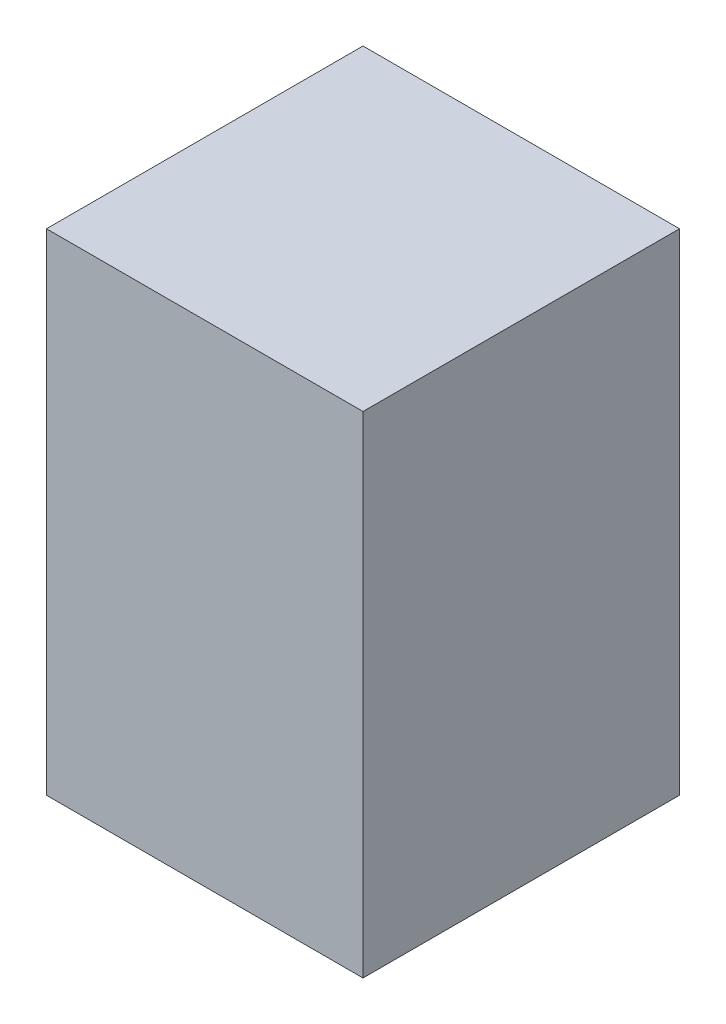
ISO-10303-21;
HEADER;
FILE_DESCRIPTION(('STEP AP214'),'2;1');
FILE_NAME('part.step','',(''),(''),'','','');
FILE_SCHEMA(('AUTOMOTIVE_DESIGN { 1 0 10303 214 1 1 1 1 }'));
ENDSEC;
DATA;
#1=APPLICATION_CONTEXT('core data for automotive mechanical design processes');
#2=APPLICATION_PROTOCOL_DEFINITION('international standard','automotive_design',2000,#1);
#3=PRODUCT_CONTEXT('',#1,'mechanical');
#4=PRODUCT('Part','Part','',(#3));
#5=PRODUCT_RELATED_PRODUCT_CATEGORY('part','',(#4));
#6=PRODUCT_DEFINITION_FORMATION('','',#4);
#7=PRODUCT_DEFINITION_CONTEXT('part definition',#1,'design');
#8=PRODUCT_DEFINITION('design','',#6,#7);
#9=PRODUCT_DEFINITION_SHAPE('','',#8);
#10=(LENGTH_UNIT() NAMED_UNIT(*) SI_UNIT(.MILLI.,.METRE.));
#11=(NAMED_UNIT(*) PLANE_ANGLE_UNIT() SI_UNIT($,.RADIAN.));
#12=(NAMED_UNIT(*) SI_UNIT($,.STERADIAN.) SOLID_ANGLE_UNIT());
#13=UNCERTAINTY_MEASURE_WITH_UNIT(LENGTH_MEASURE(1.E-05),#10,'distance_accuracy_value','');
#14=(GEOMETRIC_REPRESENTATION_CONTEXT(3) GLOBAL_UNCERTAINTY_ASSIGNED_CONTEXT((#13)) GLOBAL_UNIT_ASSIGNED_CONTEXT((#10,
#11,#12)) REPRESENTATION_CONTEXT('',''));
#15=CARTESIAN_POINT('',(0.,0.,0.));
#16=DIRECTION('',(0.,0.,1.));
#17=DIRECTION('',(1.,0.,0.));
#18=AXIS2_PLACEMENT_3D('',#15,#16,#17);
#19=CARTESIAN_POINT('',(100.,310.,100.));
#20=DIRECTION('',(-1.,0.,0.));
#21=DIRECTION('',(0.,0.,1.));
#22=AXIS2_PLACEMENT_3D('',#19,#20,#21);
#23=PLANE('',#22);
#24=DIRECTION('',(0.,0.,-1.));
#25=VECTOR('',#24,1.);
#26=CARTESIAN_POINT('',(100.,0.,100.));
#27=LINE('',#26,#25);
#28=CARTESIAN_POINT('',(100.,0.,100.));
#29=VERTEX_POINT('',#28);
#30=CARTESIAN_POINT('',(100.,0.,-100.));
#31=VERTEX_POINT('',#30);
#32=EDGE_CURVE('E96',#29,#31,#27,.T.);
#33=ORIENTED_EDGE('',*,*,#32,.T.);
#34=DIRECTION('',(0.,-1.,0.));
#35=VECTOR('',#34,1.);
#36=CARTESIAN_POINT('',(100.,310.,-100.));
#37=LINE('',#36,#35);
#38=CARTESIAN_POINT('',(100.,310.,-100.));
#39=VERTEX_POINT('',#38);
#40=EDGE_CURVE('E11',#39,#31,#37,.T.);
#41=ORIENTED_EDGE('',*,*,#40,.F.);
#42=DIRECTION('',(0.,0.,-1.));
#43=VECTOR('',#42,1.);
#44=CARTESIAN_POINT('',(100.,310.,100.));
#45=LINE('',#44,#43);
#46=CARTESIAN_POINT('',(100.,310.,100.));
#47=VERTEX_POINT('',#46);
#48=EDGE_CURVE('E84',#47,#39,#45,.T.);
#49=ORIENTED_EDGE('',*,*,#48,.F.);
#50=DIRECTION('',(0.,-1.,0.));
#51=VECTOR('',#50,1.);
#52=CARTESIAN_POINT('',(100.,310.,100.));
#53=LINE('',#52,#51);
#54=EDGE_CURVE('E92',#47,#29,#53,.T.);
#55=ORIENTED_EDGE('',*,*,#54,.T.);
#56=EDGE_LOOP('',(#33,#41,#49,#55));
#57=FACE_BOUND('',#56,.T.);
#58=ADVANCED_FACE('F33',(#57),#23,.F.);
#59=CARTESIAN_POINT('',(-100.,310.,-100.));
#60=DIRECTION('',(0.,0.,1.));
#61=DIRECTION('',(1.,0.,0.));
#62=AXIS2_PLACEMENT_3D('',#59,#60,#61);
#63=PLANE('',#62);
#64=DIRECTION('',(-1.,0.,0.));
#65=VECTOR('',#64,1.);
#66=CARTESIAN_POINT('',(-100.,0.,-100.));
#67=LINE('',#66,#65);
#68=CARTESIAN_POINT('',(-100.,0.,-100.));
#69=VERTEX_POINT('',#68);
#70=EDGE_CURVE('E88',#31,#69,#67,.T.);
#71=ORIENTED_EDGE('',*,*,#70,.T.);
#72=DIRECTION('',(0.,-1.,0.));
#73=VECTOR('',#72,1.);
#74=CARTESIAN_POINT('',(-100.,310.,-100.));
#75=LINE('',#74,#73);
#76=CARTESIAN_POINT('',(-100.,310.,-100.));
#77=VERTEX_POINT('',#76);
#78=EDGE_CURVE('E41',#77,#69,#75,.T.);
#79=ORIENTED_EDGE('',*,*,#78,.F.);
#80=DIRECTION('',(-1.,0.,0.));
#81=VECTOR('',#80,1.);
#82=CARTESIAN_POINT('',(-100.,310.,-100.));
#83=LINE('',#82,#81);
#84=EDGE_CURVE('E79',#39,#77,#83,.T.);
#85=ORIENTED_EDGE('',*,*,#84,.F.);
#86=ORIENTED_EDGE('',*,*,#40,.T.);
#87=EDGE_LOOP('',(#71,#79,#85,#86));
#88=FACE_BOUND('',#87,.T.);
#89=ADVANCED_FACE('F87',(#88),#63,.F.);
#90=CARTESIAN_POINT('',(-100.,310.,100.));
#91=DIRECTION('',(1.,0.,0.));
#92=DIRECTION('',(0.,0.,-1.));
#93=AXIS2_PLACEMENT_3D('',#90,#91,#92);
#94=PLANE('',#93);
#95=DIRECTION('',(0.,0.,1.));
#96=VECTOR('',#95,1.);
#97=CARTESIAN_POINT('',(-100.,0.,100.));
#98=LINE('',#97,#96);
#99=CARTESIAN_POINT('',(-100.,0.,100.));
#100=VERTEX_POINT('',#99);
#101=EDGE_CURVE('E66',#69,#100,#98,.T.);
#102=ORIENTED_EDGE('',*,*,#101,.T.);
#103=DIRECTION('',(0.,-1.,0.));
#104=VECTOR('',#103,1.);
#105=CARTESIAN_POINT('',(-100.,310.,100.));
#106=LINE('',#105,#104);
#107=CARTESIAN_POINT('',(-100.,310.,100.));
#108=VERTEX_POINT('',#107);
#109=EDGE_CURVE('E89',#108,#100,#106,.T.);
#110=ORIENTED_EDGE('',*,*,#109,.F.);
#111=DIRECTION('',(0.,0.,1.));
#112=VECTOR('',#111,1.);
#113=CARTESIAN_POINT('',(-100.,310.,100.));
#114=LINE('',#113,#112);
#115=EDGE_CURVE('E82',#77,#108,#114,.T.);
#116=ORIENTED_EDGE('',*,*,#115,.F.);
#117=ORIENTED_EDGE('',*,*,#78,.T.);
#118=EDGE_LOOP('',(#102,#110,#116,#117));
#119=FACE_BOUND('',#118,.T.);
#120=ADVANCED_FACE('F90',(#119),#94,.F.);
#121=CARTESIAN_POINT('',(-100.,310.,100.));
#122=DIRECTION('',(0.,0.,-1.));
#123=DIRECTION('',(-1.,0.,0.));
#124=AXIS2_PLACEMENT_3D('',#121,#122,#123);
#125=PLANE('',#124);
#126=DIRECTION('',(1.,0.,0.));
#127=VECTOR('',#126,1.);
#128=CARTESIAN_POINT('',(-100.,0.,100.));
#129=LINE('',#128,#127);
#130=EDGE_CURVE('E72',#100,#29,#129,.T.);
#131=ORIENTED_EDGE('',*,*,#130,.T.);
#132=ORIENTED_EDGE('',*,*,#54,.F.);
#133=DIRECTION('',(1.,0.,0.));
#134=VECTOR('',#133,1.);
#135=CARTESIAN_POINT('',(-100.,310.,100.));
#136=LINE('',#135,#134);
#137=EDGE_CURVE('E49',#108,#47,#136,.T.);
#138=ORIENTED_EDGE('',*,*,#137,.F.);
#139=ORIENTED_EDGE('',*,*,#109,.T.);
#140=EDGE_LOOP('',(#131,#132,#138,#139));
#141=FACE_BOUND('',#140,.T.);
#142=ADVANCED_FACE('F103',(#141),#125,.F.);
#143=CARTESIAN_POINT('',(0.,310.,0.));
#144=DIRECTION('',(0.,-1.,0.));
#145=DIRECTION('',(0.,0.,-1.));
#146=AXIS2_PLACEMENT_3D('',#143,#144,#145);
#147=PLANE('',#146);
#148=ORIENTED_EDGE('',*,*,#48,.T.);
#149=ORIENTED_EDGE('',*,*,#84,.T.);
#150=ORIENTED_EDGE('',*,*,#115,.T.);
#151=ORIENTED_EDGE('',*,*,#137,.T.);
#152=EDGE_LOOP('',(#148,#149,#150,#151));
#153=FACE_BOUND('',#152,.T.);
#154=ADVANCED_FACE('F80',(#153),#147,.F.);
#155=CARTESIAN_POINT('',(0.,0.,0.));
#156=DIRECTION('',(0.,-1.,0.));
#157=DIRECTION('',(0.,0.,-1.));
#158=AXIS2_PLACEMENT_3D('',#155,#156,#157);
#159=PLANE('',#158);
#160=ORIENTED_EDGE('',*,*,#32,.F.);
#161=ORIENTED_EDGE('',*,*,#130,.F.);
#162=ORIENTED_EDGE('',*,*,#101,.F.);
#163=ORIENTED_EDGE('',*,*,#70,.F.);
#164=EDGE_LOOP('',(#160,#161,#162,#163));
#165=FACE_BOUND('',#164,.T.);
#166=ADVANCED_FACE('F106',(#165),#159,.T.);
#167=CLOSED_SHELL('',(#58,#89,#120,#142,#154,#166));
#168=MANIFOLD_SOLID_BREP('B2',#167);
#169=ADVANCED_BREP_SHAPE_REPRESENTATION('',(#18,#168),#14);
#170=SHAPE_DEFINITION_REPRESENTATION(#9,#169);
ENDSEC;
END-ISO-10303-21;
